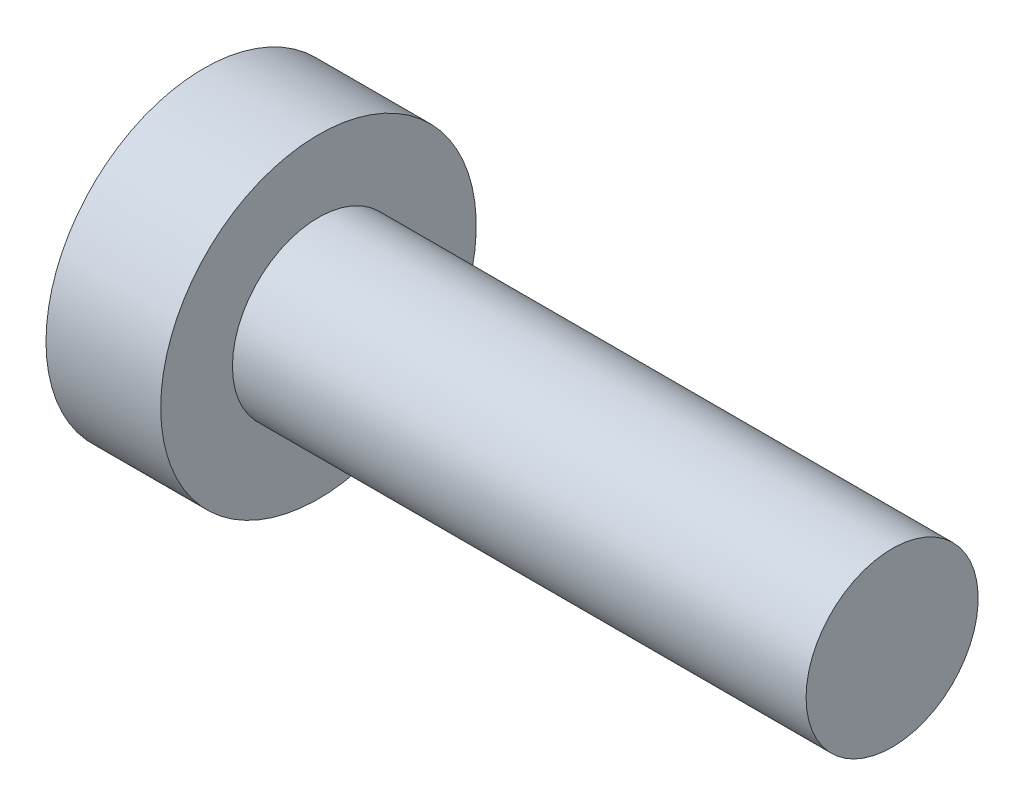
ISO-10303-21;
HEADER;
FILE_DESCRIPTION(('STEP AP214'),'2;1');
FILE_NAME('part.step','',(''),(''),'','','');
FILE_SCHEMA(('AUTOMOTIVE_DESIGN { 1 0 10303 214 1 1 1 1 }'));
ENDSEC;
DATA;
#1=APPLICATION_CONTEXT('core data for automotive mechanical design processes');
#2=APPLICATION_PROTOCOL_DEFINITION('international standard','automotive_design',2000,#1);
#3=PRODUCT_CONTEXT('',#1,'mechanical');
#4=PRODUCT('Part','Part','',(#3));
#5=PRODUCT_RELATED_PRODUCT_CATEGORY('part','',(#4));
#6=PRODUCT_DEFINITION_FORMATION('','',#4);
#7=PRODUCT_DEFINITION_CONTEXT('part definition',#1,'design');
#8=PRODUCT_DEFINITION('design','',#6,#7);
#9=PRODUCT_DEFINITION_SHAPE('','',#8);
#10=(LENGTH_UNIT() NAMED_UNIT(*) SI_UNIT(.MILLI.,.METRE.));
#11=(NAMED_UNIT(*) PLANE_ANGLE_UNIT() SI_UNIT($,.RADIAN.));
#12=(NAMED_UNIT(*) SI_UNIT($,.STERADIAN.) SOLID_ANGLE_UNIT());
#13=UNCERTAINTY_MEASURE_WITH_UNIT(LENGTH_MEASURE(1.E-05),#10,'distance_accuracy_value','');
#14=(GEOMETRIC_REPRESENTATION_CONTEXT(3) GLOBAL_UNCERTAINTY_ASSIGNED_CONTEXT((#13)) GLOBAL_UNIT_ASSIGNED_CONTEXT((#10,
#11,#12)) REPRESENTATION_CONTEXT('',''));
#15=CARTESIAN_POINT('',(0.,0.,0.));
#16=DIRECTION('',(0.,0.,1.));
#17=DIRECTION('',(1.,0.,0.));
#18=AXIS2_PLACEMENT_3D('',#15,#16,#17);
#19=CARTESIAN_POINT('',(-2.,0.,0.));
#20=DIRECTION('',(1.,0.,0.));
#21=DIRECTION('',(0.,0.,-1.));
#22=AXIS2_PLACEMENT_3D('',#19,#20,#21);
#23=PLANE('',#22);
#24=CARTESIAN_POINT('',(-2.,0.,0.));
#25=DIRECTION('',(-1.,0.,0.));
#26=DIRECTION('',(0.,0.,1.));
#27=AXIS2_PLACEMENT_3D('',#24,#25,#26);
#28=CIRCLE('',#27,2.75);
#29=CARTESIAN_POINT('',(-2.,0.,2.75));
#30=VERTEX_POINT('',#29);
#31=EDGE_CURVE('E181',#30,#30,#28,.T.);
#32=ORIENTED_EDGE('',*,*,#31,.T.);
#33=EDGE_LOOP('',(#32));
#34=FACE_BOUND('',#33,.T.);
#35=DIRECTION('',(0.,-0.5,-0.866025403784439));
#36=VECTOR('',#35,1.);
#37=CARTESIAN_POINT('',(-2.,1.44337567297407,0.));
#38=LINE('',#37,#36);
#39=CARTESIAN_POINT('',(-2.,1.44337567297407,0.));
#40=VERTEX_POINT('',#39);
#41=CARTESIAN_POINT('',(-2.,0.721687836487033,-1.25));
#42=VERTEX_POINT('',#41);
#43=EDGE_CURVE('E154',#40,#42,#38,.T.);
#44=ORIENTED_EDGE('',*,*,#43,.F.);
#45=DIRECTION('',(0.,0.5,-0.866025403784439));
#46=VECTOR('',#45,1.);
#47=CARTESIAN_POINT('',(-2.,0.721687836487033,1.25));
#48=LINE('',#47,#46);
#49=CARTESIAN_POINT('',(-2.,0.721687836487033,1.25));
#50=VERTEX_POINT('',#49);
#51=EDGE_CURVE('E55',#50,#40,#48,.T.);
#52=ORIENTED_EDGE('',*,*,#51,.F.);
#53=DIRECTION('',(0.,1.,0.));
#54=VECTOR('',#53,1.);
#55=CARTESIAN_POINT('',(-2.,-0.721687836487033,1.25));
#56=LINE('',#55,#54);
#57=CARTESIAN_POINT('',(-2.,-0.721687836487033,1.25));
#58=VERTEX_POINT('',#57);
#59=EDGE_CURVE('E125',#58,#50,#56,.T.);
#60=ORIENTED_EDGE('',*,*,#59,.F.);
#61=DIRECTION('',(0.,0.5,0.866025403784439));
#62=VECTOR('',#61,1.);
#63=CARTESIAN_POINT('',(-2.,-1.44337567297406,0.));
#64=LINE('',#63,#62);
#65=CARTESIAN_POINT('',(-2.,-1.44337567297406,0.));
#66=VERTEX_POINT('',#65);
#67=EDGE_CURVE('E160',#66,#58,#64,.T.);
#68=ORIENTED_EDGE('',*,*,#67,.F.);
#69=DIRECTION('',(0.,-0.5,0.866025403784439));
#70=VECTOR('',#69,1.);
#71=CARTESIAN_POINT('',(-2.,-0.721687836487032,-1.25));
#72=LINE('',#71,#70);
#73=CARTESIAN_POINT('',(-2.,-0.721687836487032,-1.25));
#74=VERTEX_POINT('',#73);
#75=EDGE_CURVE('E158',#74,#66,#72,.T.);
#76=ORIENTED_EDGE('',*,*,#75,.F.);
#77=DIRECTION('',(0.,-1.,0.));
#78=VECTOR('',#77,1.);
#79=CARTESIAN_POINT('',(-2.,0.721687836487033,-1.25));
#80=LINE('',#79,#78);
#81=EDGE_CURVE('E156',#42,#74,#80,.T.);
#82=ORIENTED_EDGE('',*,*,#81,.F.);
#83=EDGE_LOOP('',(#44,#52,#60,#68,#76,#82));
#84=FACE_BOUND('',#83,.T.);
#85=ADVANCED_FACE('F40',(#34,#84),#23,.F.);
#86=CARTESIAN_POINT('',(-22.3581394190768,0.,0.));
#87=DIRECTION('',(-1.,0.,0.));
#88=DIRECTION('',(0.,0.,1.));
#89=AXIS2_PLACEMENT_3D('',#86,#87,#88);
#90=CYLINDRICAL_SURFACE('',#89,2.75);
#91=ORIENTED_EDGE('',*,*,#31,.F.);
#92=EDGE_LOOP('',(#91));
#93=FACE_BOUND('',#92,.T.);
#94=CARTESIAN_POINT('',(0.,0.,0.));
#95=DIRECTION('',(-1.,0.,0.));
#96=DIRECTION('',(0.,0.,1.));
#97=AXIS2_PLACEMENT_3D('',#94,#95,#96);
#98=CIRCLE('',#97,2.75);
#99=CARTESIAN_POINT('',(0.,0.,2.75));
#100=VERTEX_POINT('',#99);
#101=EDGE_CURVE('E11',#100,#100,#98,.T.);
#102=ORIENTED_EDGE('',*,*,#101,.T.);
#103=EDGE_LOOP('',(#102));
#104=FACE_BOUND('',#103,.T.);
#105=ADVANCED_FACE('F42',(#93,#104),#90,.T.);
#106=CARTESIAN_POINT('',(0.,2.75,0.));
#107=DIRECTION('',(-1.,0.,0.));
#108=DIRECTION('',(0.,0.,1.));
#109=AXIS2_PLACEMENT_3D('',#106,#107,#108);
#110=PLANE('',#109);
#111=ORIENTED_EDGE('',*,*,#101,.F.);
#112=EDGE_LOOP('',(#111));
#113=FACE_BOUND('',#112,.T.);
#114=CARTESIAN_POINT('',(0.,0.,0.));
#115=DIRECTION('',(-1.,0.,0.));
#116=DIRECTION('',(0.,0.,1.));
#117=AXIS2_PLACEMENT_3D('',#114,#115,#116);
#118=CIRCLE('',#117,1.5);
#119=CARTESIAN_POINT('',(0.,0.,1.5));
#120=VERTEX_POINT('',#119);
#121=EDGE_CURVE('E48',#120,#120,#118,.T.);
#122=ORIENTED_EDGE('',*,*,#121,.T.);
#123=EDGE_LOOP('',(#122));
#124=FACE_BOUND('',#123,.T.);
#125=ADVANCED_FACE('F189',(#113,#124),#110,.F.);
#126=CARTESIAN_POINT('',(-22.3581394190768,0.,0.));
#127=DIRECTION('',(-1.,0.,0.));
#128=DIRECTION('',(0.,0.,1.));
#129=AXIS2_PLACEMENT_3D('',#126,#127,#128);
#130=CYLINDRICAL_SURFACE('',#129,1.5);
#131=ORIENTED_EDGE('',*,*,#121,.F.);
#132=EDGE_LOOP('',(#131));
#133=FACE_BOUND('',#132,.T.);
#134=CARTESIAN_POINT('',(10.,0.,0.));
#135=DIRECTION('',(-1.,0.,0.));
#136=DIRECTION('',(0.,0.,1.));
#137=AXIS2_PLACEMENT_3D('',#134,#135,#136);
#138=CIRCLE('',#137,1.5);
#139=CARTESIAN_POINT('',(10.,0.,1.5));
#140=VERTEX_POINT('',#139);
#141=EDGE_CURVE('E184',#140,#140,#138,.T.);
#142=ORIENTED_EDGE('',*,*,#141,.T.);
#143=EDGE_LOOP('',(#142));
#144=FACE_BOUND('',#143,.T.);
#145=ADVANCED_FACE('F191',(#133,#144),#130,.T.);
#146=CARTESIAN_POINT('',(10.,1.5,0.));
#147=DIRECTION('',(-1.,0.,0.));
#148=DIRECTION('',(0.,0.,1.));
#149=AXIS2_PLACEMENT_3D('',#146,#147,#148);
#150=PLANE('',#149);
#151=ORIENTED_EDGE('',*,*,#141,.F.);
#152=EDGE_LOOP('',(#151));
#153=FACE_BOUND('',#152,.T.);
#154=ADVANCED_FACE('F194',(#153),#150,.F.);
#155=CARTESIAN_POINT('',(-0.5,0.721687836487033,1.25));
#156=DIRECTION('',(0.,0.866025403784438,0.5));
#157=DIRECTION('',(0.,-0.5,0.866025403784439));
#158=AXIS2_PLACEMENT_3D('',#155,#156,#157);
#159=PLANE('',#158);
#160=DIRECTION('',(0.,0.5,-0.866025403784439));
#161=VECTOR('',#160,1.);
#162=CARTESIAN_POINT('',(-0.5,0.721687836487033,1.25));
#163=LINE('',#162,#161);
#164=CARTESIAN_POINT('',(-0.5,0.721687836487033,1.25));
#165=VERTEX_POINT('',#164);
#166=CARTESIAN_POINT('',(-0.5,1.08253175473055,0.625));
#167=VERTEX_POINT('',#166);
#168=EDGE_CURVE('E124',#165,#167,#163,.T.);
#169=ORIENTED_EDGE('',*,*,#168,.F.);
#170=DIRECTION('',(-1.,0.,0.));
#171=VECTOR('',#170,1.);
#172=CARTESIAN_POINT('',(-0.5,0.721687836487033,1.25));
#173=LINE('',#172,#171);
#174=EDGE_CURVE('E164',#165,#50,#173,.T.);
#175=ORIENTED_EDGE('',*,*,#174,.T.);
#176=ORIENTED_EDGE('',*,*,#51,.T.);
#177=DIRECTION('',(-1.,0.,0.));
#178=VECTOR('',#177,1.);
#179=CARTESIAN_POINT('',(-0.5,1.44337567297407,0.));
#180=LINE('',#179,#178);
#181=CARTESIAN_POINT('',(-0.5,1.44337567297407,0.));
#182=VERTEX_POINT('',#181);
#183=EDGE_CURVE('E127',#182,#40,#180,.T.);
#184=ORIENTED_EDGE('',*,*,#183,.F.);
#185=EDGE_CURVE('E116',#167,#182,#163,.T.);
#186=ORIENTED_EDGE('',*,*,#185,.F.);
#187=EDGE_LOOP('',(#169,#175,#176,#184,#186));
#188=FACE_BOUND('',#187,.T.);
#189=ADVANCED_FACE('F128',(#188),#159,.F.);
#190=CARTESIAN_POINT('',(-0.5,-0.721687836487033,1.25));
#191=DIRECTION('',(0.,0.,1.));
#192=DIRECTION('',(1.,0.,0.));
#193=AXIS2_PLACEMENT_3D('',#190,#191,#192);
#194=PLANE('',#193);
#195=DIRECTION('',(0.,1.,0.));
#196=VECTOR('',#195,1.);
#197=CARTESIAN_POINT('',(-0.5,-0.721687836487033,1.25));
#198=LINE('',#197,#196);
#199=CARTESIAN_POINT('',(-0.5,-0.721687836487033,1.25));
#200=VERTEX_POINT('',#199);
#201=CARTESIAN_POINT('',(-0.5,0.,1.25));
#202=VERTEX_POINT('',#201);
#203=EDGE_CURVE('E63',#200,#202,#198,.T.);
#204=ORIENTED_EDGE('',*,*,#203,.F.);
#205=DIRECTION('',(-1.,0.,0.));
#206=VECTOR('',#205,1.);
#207=CARTESIAN_POINT('',(-0.5,-0.721687836487033,1.25));
#208=LINE('',#207,#206);
#209=EDGE_CURVE('E167',#200,#58,#208,.T.);
#210=ORIENTED_EDGE('',*,*,#209,.T.);
#211=ORIENTED_EDGE('',*,*,#59,.T.);
#212=ORIENTED_EDGE('',*,*,#174,.F.);
#213=EDGE_CURVE('E151',#202,#165,#198,.T.);
#214=ORIENTED_EDGE('',*,*,#213,.F.);
#215=EDGE_LOOP('',(#204,#210,#211,#212,#214));
#216=FACE_BOUND('',#215,.T.);
#217=ADVANCED_FACE('F203',(#216),#194,.F.);
#218=CARTESIAN_POINT('',(-0.5,-1.44337567297406,0.));
#219=DIRECTION('',(0.,-0.866025403784439,0.5));
#220=DIRECTION('',(0.,-0.5,-0.866025403784439));
#221=AXIS2_PLACEMENT_3D('',#218,#219,#220);
#222=PLANE('',#221);
#223=DIRECTION('',(0.,0.5,0.866025403784439));
#224=VECTOR('',#223,1.);
#225=CARTESIAN_POINT('',(-0.5,-1.44337567297406,0.));
#226=LINE('',#225,#224);
#227=CARTESIAN_POINT('',(-0.5,-1.44337567297406,0.));
#228=VERTEX_POINT('',#227);
#229=CARTESIAN_POINT('',(-0.5,-1.08253175473055,0.625));
#230=VERTEX_POINT('',#229);
#231=EDGE_CURVE('E148',#228,#230,#226,.T.);
#232=ORIENTED_EDGE('',*,*,#231,.F.);
#233=DIRECTION('',(-1.,0.,0.));
#234=VECTOR('',#233,1.);
#235=CARTESIAN_POINT('',(-0.5,-1.44337567297406,0.));
#236=LINE('',#235,#234);
#237=EDGE_CURVE('E170',#228,#66,#236,.T.);
#238=ORIENTED_EDGE('',*,*,#237,.T.);
#239=ORIENTED_EDGE('',*,*,#67,.T.);
#240=ORIENTED_EDGE('',*,*,#209,.F.);
#241=EDGE_CURVE('E147',#230,#200,#226,.T.);
#242=ORIENTED_EDGE('',*,*,#241,.F.);
#243=EDGE_LOOP('',(#232,#238,#239,#240,#242));
#244=FACE_BOUND('',#243,.T.);
#245=ADVANCED_FACE('F229',(#244),#222,.F.);
#246=CARTESIAN_POINT('',(-0.5,-0.721687836487032,-1.25));
#247=DIRECTION('',(0.,-0.866025403784439,-0.5));
#248=DIRECTION('',(0.,0.5,-0.866025403784439));
#249=AXIS2_PLACEMENT_3D('',#246,#247,#248);
#250=PLANE('',#249);
#251=DIRECTION('',(0.,-0.5,0.866025403784439));
#252=VECTOR('',#251,1.);
#253=CARTESIAN_POINT('',(-0.5,-0.721687836487032,-1.25));
#254=LINE('',#253,#252);
#255=CARTESIAN_POINT('',(-0.5,-0.721687836487032,-1.25));
#256=VERTEX_POINT('',#255);
#257=CARTESIAN_POINT('',(-0.5,-1.08253175473055,-0.625000000000001));
#258=VERTEX_POINT('',#257);
#259=EDGE_CURVE('E144',#256,#258,#254,.T.);
#260=ORIENTED_EDGE('',*,*,#259,.F.);
#261=DIRECTION('',(-1.,0.,0.));
#262=VECTOR('',#261,1.);
#263=CARTESIAN_POINT('',(-0.5,-0.721687836487032,-1.25));
#264=LINE('',#263,#262);
#265=EDGE_CURVE('E173',#256,#74,#264,.T.);
#266=ORIENTED_EDGE('',*,*,#265,.T.);
#267=ORIENTED_EDGE('',*,*,#75,.T.);
#268=ORIENTED_EDGE('',*,*,#237,.F.);
#269=EDGE_CURVE('E143',#258,#228,#254,.T.);
#270=ORIENTED_EDGE('',*,*,#269,.F.);
#271=EDGE_LOOP('',(#260,#266,#267,#268,#270));
#272=FACE_BOUND('',#271,.T.);
#273=ADVANCED_FACE('F225',(#272),#250,.F.);
#274=CARTESIAN_POINT('',(-0.5,0.721687836487033,-1.25));
#275=DIRECTION('',(0.,0.,-1.));
#276=DIRECTION('',(-1.,0.,0.));
#277=AXIS2_PLACEMENT_3D('',#274,#275,#276);
#278=PLANE('',#277);
#279=DIRECTION('',(0.,-1.,0.));
#280=VECTOR('',#279,1.);
#281=CARTESIAN_POINT('',(-0.5,0.721687836487033,-1.25));
#282=LINE('',#281,#280);
#283=CARTESIAN_POINT('',(-0.5,0.721687836487033,-1.25));
#284=VERTEX_POINT('',#283);
#285=CARTESIAN_POINT('',(-0.5,0.,-1.25));
#286=VERTEX_POINT('',#285);
#287=EDGE_CURVE('E139',#284,#286,#282,.T.);
#288=ORIENTED_EDGE('',*,*,#287,.F.);
#289=DIRECTION('',(-1.,0.,0.));
#290=VECTOR('',#289,1.);
#291=CARTESIAN_POINT('',(-0.5,0.721687836487033,-1.25));
#292=LINE('',#291,#290);
#293=EDGE_CURVE('E131',#284,#42,#292,.T.);
#294=ORIENTED_EDGE('',*,*,#293,.T.);
#295=ORIENTED_EDGE('',*,*,#81,.T.);
#296=ORIENTED_EDGE('',*,*,#265,.F.);
#297=EDGE_CURVE('E137',#286,#256,#282,.T.);
#298=ORIENTED_EDGE('',*,*,#297,.F.);
#299=EDGE_LOOP('',(#288,#294,#295,#296,#298));
#300=FACE_BOUND('',#299,.T.);
#301=ADVANCED_FACE('F222',(#300),#278,.F.);
#302=CARTESIAN_POINT('',(-0.5,1.44337567297407,0.));
#303=DIRECTION('',(0.,0.866025403784439,-0.5));
#304=DIRECTION('',(0.,0.5,0.866025403784439));
#305=AXIS2_PLACEMENT_3D('',#302,#303,#304);
#306=PLANE('',#305);
#307=DIRECTION('',(0.,-0.5,-0.866025403784439));
#308=VECTOR('',#307,1.);
#309=CARTESIAN_POINT('',(-0.5,1.44337567297407,0.));
#310=LINE('',#309,#308);
#311=CARTESIAN_POINT('',(-0.5,1.08253175473055,-0.625));
#312=VERTEX_POINT('',#311);
#313=EDGE_CURVE('E119',#182,#312,#310,.T.);
#314=ORIENTED_EDGE('',*,*,#313,.F.);
#315=ORIENTED_EDGE('',*,*,#183,.T.);
#316=ORIENTED_EDGE('',*,*,#43,.T.);
#317=ORIENTED_EDGE('',*,*,#293,.F.);
#318=EDGE_CURVE('E136',#312,#284,#310,.T.);
#319=ORIENTED_EDGE('',*,*,#318,.F.);
#320=EDGE_LOOP('',(#314,#315,#316,#317,#319));
#321=FACE_BOUND('',#320,.T.);
#322=ADVANCED_FACE('F134',(#321),#306,.F.);
#323=CARTESIAN_POINT('',(-0.5,0.,0.));
#324=DIRECTION('',(-1.,0.,0.));
#325=DIRECTION('',(0.,0.,1.));
#326=AXIS2_PLACEMENT_3D('',#323,#324,#325);
#327=PLANE('',#326);
#328=ORIENTED_EDGE('',*,*,#213,.T.);
#329=ORIENTED_EDGE('',*,*,#168,.T.);
#330=CARTESIAN_POINT('',(-0.5,0.,0.));
#331=DIRECTION('',(-1.,0.,0.));
#332=DIRECTION('',(0.,0.,1.));
#333=AXIS2_PLACEMENT_3D('',#330,#331,#332);
#334=CIRCLE('',#333,1.25);
#335=EDGE_CURVE('E178',#202,#167,#334,.T.);
#336=ORIENTED_EDGE('',*,*,#335,.F.);
#337=EDGE_LOOP('',(#328,#329,#336));
#338=FACE_BOUND('',#337,.T.);
#339=ADVANCED_FACE('F221',(#338),#327,.T.);
#340=ORIENTED_EDGE('',*,*,#185,.T.);
#341=ORIENTED_EDGE('',*,*,#313,.T.);
#342=EDGE_CURVE('E121',#167,#312,#334,.T.);
#343=ORIENTED_EDGE('',*,*,#342,.F.);
#344=EDGE_LOOP('',(#340,#341,#343));
#345=FACE_BOUND('',#344,.T.);
#346=ADVANCED_FACE('F117',(#345),#327,.T.);
#347=ORIENTED_EDGE('',*,*,#318,.T.);
#348=ORIENTED_EDGE('',*,*,#287,.T.);
#349=EDGE_CURVE('E261',#312,#286,#334,.T.);
#350=ORIENTED_EDGE('',*,*,#349,.F.);
#351=EDGE_LOOP('',(#347,#348,#350));
#352=FACE_BOUND('',#351,.T.);
#353=ADVANCED_FACE('F249',(#352),#327,.T.);
#354=ORIENTED_EDGE('',*,*,#297,.T.);
#355=ORIENTED_EDGE('',*,*,#259,.T.);
#356=EDGE_CURVE('E265',#286,#258,#334,.T.);
#357=ORIENTED_EDGE('',*,*,#356,.F.);
#358=EDGE_LOOP('',(#354,#355,#357));
#359=FACE_BOUND('',#358,.T.);
#360=ADVANCED_FACE('F242',(#359),#327,.T.);
#361=ORIENTED_EDGE('',*,*,#269,.T.);
#362=ORIENTED_EDGE('',*,*,#231,.T.);
#363=EDGE_CURVE('E266',#258,#230,#334,.T.);
#364=ORIENTED_EDGE('',*,*,#363,.F.);
#365=EDGE_LOOP('',(#361,#362,#364));
#366=FACE_BOUND('',#365,.T.);
#367=ADVANCED_FACE('F238',(#366),#327,.T.);
#368=ORIENTED_EDGE('',*,*,#241,.T.);
#369=ORIENTED_EDGE('',*,*,#203,.T.);
#370=EDGE_CURVE('E166',#230,#202,#334,.T.);
#371=ORIENTED_EDGE('',*,*,#370,.F.);
#372=EDGE_LOOP('',(#368,#369,#371));
#373=FACE_BOUND('',#372,.T.);
#374=ADVANCED_FACE('F216',(#373),#327,.T.);
#375=CARTESIAN_POINT('',(0.221687836487029,0.,0.));
#376=DIRECTION('',(-1.,0.,0.));
#377=DIRECTION('',(0.,0.,1.));
#378=AXIS2_PLACEMENT_3D('',#375,#376,#377);
#379=CONICAL_SURFACE('',#378,0.,1.0471975511966);
#380=ORIENTED_EDGE('',*,*,#335,.T.);
#381=ORIENTED_EDGE('',*,*,#342,.T.);
#382=ORIENTED_EDGE('',*,*,#349,.T.);
#383=ORIENTED_EDGE('',*,*,#356,.T.);
#384=ORIENTED_EDGE('',*,*,#363,.T.);
#385=ORIENTED_EDGE('',*,*,#370,.T.);
#386=EDGE_LOOP('',(#380,#381,#382,#383,#384,#385));
#387=FACE_BOUND('',#386,.T.);
#388=CARTESIAN_POINT('',(0.221687836487029,0.,0.));
#389=VERTEX_POINT('',#388);
#390=VERTEX_LOOP('',#389);
#391=FACE_BOUND('',#390,.T.);
#392=ADVANCED_FACE('F214',(#387,#391),#379,.F.);
#393=CLOSED_SHELL('',(#85,#105,#125,#145,#154,#189,#217,#245,#273,#301,#322,#339,#346,#353,#360,
#367,#374,#392));
#394=MANIFOLD_SOLID_BREP('B2',#393);
#395=ADVANCED_BREP_SHAPE_REPRESENTATION('',(#18,#394),#14);
#396=SHAPE_DEFINITION_REPRESENTATION(#9,#395);
ENDSEC;
END-ISO-10303-21;
